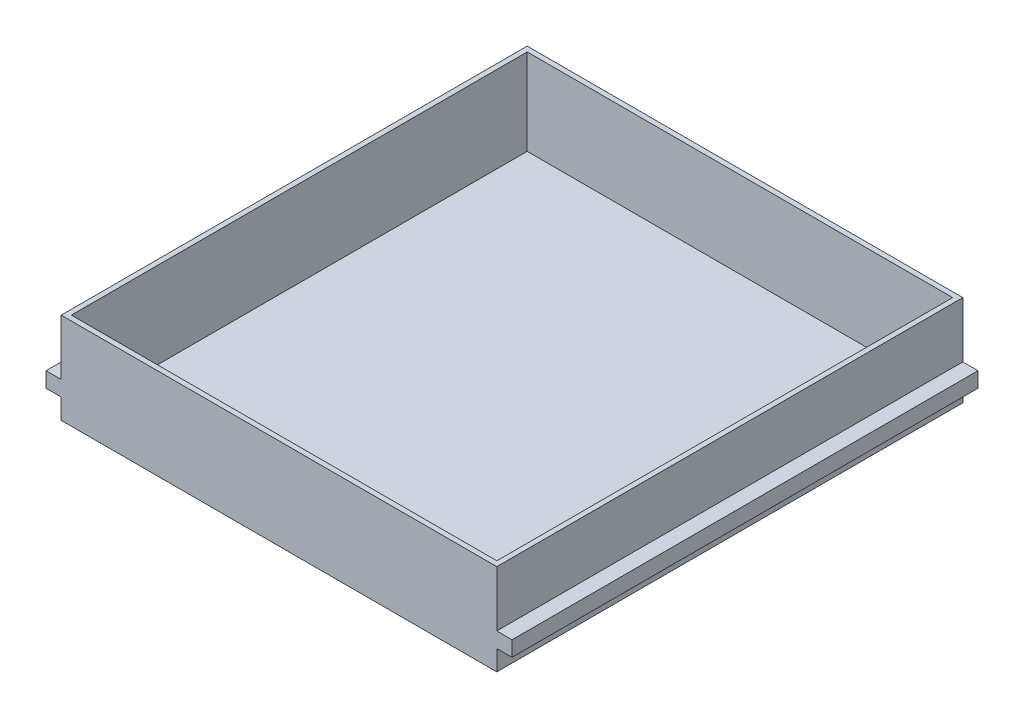
ISO-10303-21;
HEADER;
FILE_DESCRIPTION(('STEP AP214'),'2;1');
FILE_NAME('part.step','',(''),(''),'','','');
FILE_SCHEMA(('AUTOMOTIVE_DESIGN { 1 0 10303 214 1 1 1 1 }'));
ENDSEC;
DATA;
#1=APPLICATION_CONTEXT('core data for automotive mechanical design processes');
#2=APPLICATION_PROTOCOL_DEFINITION('international standard','automotive_design',2000,#1);
#3=PRODUCT_CONTEXT('',#1,'mechanical');
#4=PRODUCT('Part','Part','',(#3));
#5=PRODUCT_RELATED_PRODUCT_CATEGORY('part','',(#4));
#6=PRODUCT_DEFINITION_FORMATION('','',#4);
#7=PRODUCT_DEFINITION_CONTEXT('part definition',#1,'design');
#8=PRODUCT_DEFINITION('design','',#6,#7);
#9=PRODUCT_DEFINITION_SHAPE('','',#8);
#10=(LENGTH_UNIT() NAMED_UNIT(*) SI_UNIT(.MILLI.,.METRE.));
#11=(NAMED_UNIT(*) PLANE_ANGLE_UNIT() SI_UNIT($,.RADIAN.));
#12=(NAMED_UNIT(*) SI_UNIT($,.STERADIAN.) SOLID_ANGLE_UNIT());
#13=UNCERTAINTY_MEASURE_WITH_UNIT(LENGTH_MEASURE(1.E-05),#10,'distance_accuracy_value','');
#14=(GEOMETRIC_REPRESENTATION_CONTEXT(3) GLOBAL_UNCERTAINTY_ASSIGNED_CONTEXT((#13)) GLOBAL_UNIT_ASSIGNED_CONTEXT((#10,
#11,#12)) REPRESENTATION_CONTEXT('',''));
#15=CARTESIAN_POINT('',(0.,0.,0.));
#16=DIRECTION('',(0.,0.,1.));
#17=DIRECTION('',(1.,0.,0.));
#18=AXIS2_PLACEMENT_3D('',#15,#16,#17);
#19=CARTESIAN_POINT('',(546.1,12.7,584.2));
#20=DIRECTION('',(-1.,0.,0.));
#21=DIRECTION('',(0.,0.,1.));
#22=AXIS2_PLACEMENT_3D('',#19,#20,#21);
#23=PLANE('',#22);
#24=DIRECTION('',(0.,0.,-1.));
#25=VECTOR('',#24,1.);
#26=CARTESIAN_POINT('',(546.1,50.8,638.081536726415));
#27=LINE('',#26,#25);
#28=CARTESIAN_POINT('',(546.1,50.8,584.2));
#29=VERTEX_POINT('',#28);
#30=CARTESIAN_POINT('',(546.1,50.8,-584.2));
#31=VERTEX_POINT('',#30);
#32=EDGE_CURVE('E50',#29,#31,#27,.T.);
#33=ORIENTED_EDGE('',*,*,#32,.F.);
#34=DIRECTION('',(0.,-1.,0.));
#35=VECTOR('',#34,1.);
#36=CARTESIAN_POINT('',(546.1,12.7,584.2));
#37=LINE('',#36,#35);
#38=CARTESIAN_POINT('',(546.1,0.,584.2));
#39=VERTEX_POINT('',#38);
#40=EDGE_CURVE('E265',#29,#39,#37,.T.);
#41=ORIENTED_EDGE('',*,*,#40,.T.);
#42=DIRECTION('',(0.,0.,-1.));
#43=VECTOR('',#42,1.);
#44=CARTESIAN_POINT('',(546.1,0.,584.2));
#45=LINE('',#44,#43);
#46=CARTESIAN_POINT('',(546.1,0.,-584.2));
#47=VERTEX_POINT('',#46);
#48=EDGE_CURVE('E254',#39,#47,#45,.T.);
#49=ORIENTED_EDGE('',*,*,#48,.T.);
#50=DIRECTION('',(0.,-1.,0.));
#51=VECTOR('',#50,1.);
#52=CARTESIAN_POINT('',(546.1,12.7,-584.2));
#53=LINE('',#52,#51);
#54=EDGE_CURVE('E43',#31,#47,#53,.T.);
#55=ORIENTED_EDGE('',*,*,#54,.F.);
#56=EDGE_LOOP('',(#33,#41,#49,#55));
#57=FACE_BOUND('',#56,.T.);
#58=ADVANCED_FACE('F35',(#57),#23,.F.);
#59=CARTESIAN_POINT('',(-546.1,12.7,584.2));
#60=DIRECTION('',(1.,0.,0.));
#61=DIRECTION('',(0.,0.,-1.));
#62=AXIS2_PLACEMENT_3D('',#59,#60,#61);
#63=PLANE('',#62);
#64=DIRECTION('',(0.,0.,-1.));
#65=VECTOR('',#64,1.);
#66=CARTESIAN_POINT('',(-546.1,88.9,638.081536726415));
#67=LINE('',#66,#65);
#68=CARTESIAN_POINT('',(-546.1,88.9,584.2));
#69=VERTEX_POINT('',#68);
#70=CARTESIAN_POINT('',(-546.1,88.9,-584.2));
#71=VERTEX_POINT('',#70);
#72=EDGE_CURVE('E188',#69,#71,#67,.T.);
#73=ORIENTED_EDGE('',*,*,#72,.F.);
#74=DIRECTION('',(0.,-1.,0.));
#75=VECTOR('',#74,1.);
#76=CARTESIAN_POINT('',(-546.1,12.7,584.2));
#77=LINE('',#76,#75);
#78=CARTESIAN_POINT('',(-546.1,228.6,584.2));
#79=VERTEX_POINT('',#78);
#80=EDGE_CURVE('E268',#79,#69,#77,.T.);
#81=ORIENTED_EDGE('',*,*,#80,.F.);
#82=DIRECTION('',(0.,0.,1.));
#83=VECTOR('',#82,1.);
#84=CARTESIAN_POINT('',(-546.1,228.6,0.));
#85=LINE('',#84,#83);
#86=CARTESIAN_POINT('',(-546.1,228.6,-584.2));
#87=VERTEX_POINT('',#86);
#88=EDGE_CURVE('E232',#87,#79,#85,.T.);
#89=ORIENTED_EDGE('',*,*,#88,.F.);
#90=DIRECTION('',(0.,-1.,0.));
#91=VECTOR('',#90,1.);
#92=CARTESIAN_POINT('',(-546.1,12.7,-584.2));
#93=LINE('',#92,#91);
#94=EDGE_CURVE('E271',#87,#71,#93,.T.);
#95=ORIENTED_EDGE('',*,*,#94,.T.);
#96=EDGE_LOOP('',(#73,#81,#89,#95));
#97=FACE_BOUND('',#96,.T.);
#98=ADVANCED_FACE('F300',(#97),#63,.F.);
#99=CARTESIAN_POINT('',(546.1,228.6,584.2));
#100=VERTEX_POINT('',#99);
#101=CARTESIAN_POINT('',(546.1,88.9,584.2));
#102=VERTEX_POINT('',#101);
#103=EDGE_CURVE('E58',#100,#102,#37,.T.);
#104=ORIENTED_EDGE('',*,*,#103,.T.);
#105=DIRECTION('',(0.,0.,-1.));
#106=VECTOR('',#105,1.);
#107=CARTESIAN_POINT('',(546.1,88.9,638.081536726415));
#108=LINE('',#107,#106);
#109=CARTESIAN_POINT('',(546.1,88.9,-584.2));
#110=VERTEX_POINT('',#109);
#111=EDGE_CURVE('E159',#102,#110,#108,.T.);
#112=ORIENTED_EDGE('',*,*,#111,.T.);
#113=CARTESIAN_POINT('',(546.1,228.6,-584.2));
#114=VERTEX_POINT('',#113);
#115=EDGE_CURVE('E11',#114,#110,#53,.T.);
#116=ORIENTED_EDGE('',*,*,#115,.F.);
#117=DIRECTION('',(0.,0.,-1.));
#118=VECTOR('',#117,1.);
#119=CARTESIAN_POINT('',(546.1,228.6,0.));
#120=LINE('',#119,#118);
#121=EDGE_CURVE('E226',#100,#114,#120,.T.);
#122=ORIENTED_EDGE('',*,*,#121,.F.);
#123=EDGE_LOOP('',(#104,#112,#116,#122));
#124=FACE_BOUND('',#123,.T.);
#125=ADVANCED_FACE('F37',(#124),#23,.F.);
#126=CARTESIAN_POINT('',(-546.1,12.7,-584.2));
#127=DIRECTION('',(0.,0.,1.));
#128=DIRECTION('',(1.,0.,0.));
#129=AXIS2_PLACEMENT_3D('',#126,#127,#128);
#130=PLANE('',#129);
#131=DIRECTION('',(-1.,0.,0.));
#132=VECTOR('',#131,1.);
#133=CARTESIAN_POINT('',(-546.1,0.,-584.2));
#134=LINE('',#133,#132);
#135=CARTESIAN_POINT('',(-546.1,0.,-584.2));
#136=VERTEX_POINT('',#135);
#137=EDGE_CURVE('E257',#47,#136,#134,.T.);
#138=ORIENTED_EDGE('',*,*,#137,.T.);
#139=CARTESIAN_POINT('',(-546.1,50.8,-584.2));
#140=VERTEX_POINT('',#139);
#141=EDGE_CURVE('E270',#140,#136,#93,.T.);
#142=ORIENTED_EDGE('',*,*,#141,.F.);
#143=DIRECTION('',(-1.,0.,0.));
#144=VECTOR('',#143,1.);
#145=CARTESIAN_POINT('',(-546.1,50.8,-584.2));
#146=LINE('',#145,#144);
#147=CARTESIAN_POINT('',(-584.2,50.8,-584.2));
#148=VERTEX_POINT('',#147);
#149=EDGE_CURVE('E184',#140,#148,#146,.T.);
#150=ORIENTED_EDGE('',*,*,#149,.T.);
#151=DIRECTION('',(0.,1.,0.));
#152=VECTOR('',#151,1.);
#153=CARTESIAN_POINT('',(-584.2,50.8,-584.2));
#154=LINE('',#153,#152);
#155=CARTESIAN_POINT('',(-584.2,88.9,-584.2));
#156=VERTEX_POINT('',#155);
#157=EDGE_CURVE('E193',#148,#156,#154,.T.);
#158=ORIENTED_EDGE('',*,*,#157,.T.);
#159=DIRECTION('',(1.,0.,0.));
#160=VECTOR('',#159,1.);
#161=CARTESIAN_POINT('',(-546.1,88.9,-584.2));
#162=LINE('',#161,#160);
#163=EDGE_CURVE('E196',#156,#71,#162,.T.);
#164=ORIENTED_EDGE('',*,*,#163,.T.);
#165=ORIENTED_EDGE('',*,*,#94,.F.);
#166=DIRECTION('',(-1.,0.,0.));
#167=VECTOR('',#166,1.);
#168=CARTESIAN_POINT('',(0.,228.6,-584.2));
#169=LINE('',#168,#167);
#170=EDGE_CURVE('E229',#114,#87,#169,.T.);
#171=ORIENTED_EDGE('',*,*,#170,.F.);
#172=ORIENTED_EDGE('',*,*,#115,.T.);
#173=DIRECTION('',(1.,0.,0.));
#174=VECTOR('',#173,1.);
#175=CARTESIAN_POINT('',(546.1,88.9,-584.2));
#176=LINE('',#175,#174);
#177=CARTESIAN_POINT('',(584.2,88.9,-584.2));
#178=VERTEX_POINT('',#177);
#179=EDGE_CURVE('E154',#110,#178,#176,.T.);
#180=ORIENTED_EDGE('',*,*,#179,.T.);
#181=DIRECTION('',(0.,-1.,0.));
#182=VECTOR('',#181,1.);
#183=CARTESIAN_POINT('',(584.2,50.8,-584.2));
#184=LINE('',#183,#182);
#185=CARTESIAN_POINT('',(584.2,50.8,-584.2));
#186=VERTEX_POINT('',#185);
#187=EDGE_CURVE('E162',#178,#186,#184,.T.);
#188=ORIENTED_EDGE('',*,*,#187,.T.);
#189=DIRECTION('',(-1.,0.,0.));
#190=VECTOR('',#189,1.);
#191=CARTESIAN_POINT('',(546.1,50.8,-584.2));
#192=LINE('',#191,#190);
#193=EDGE_CURVE('E168',#186,#31,#192,.T.);
#194=ORIENTED_EDGE('',*,*,#193,.T.);
#195=ORIENTED_EDGE('',*,*,#54,.T.);
#196=EDGE_LOOP('',(#138,#142,#150,#158,#164,#165,#171,#172,#180,#188,#194,#195));
#197=FACE_BOUND('',#196,.T.);
#198=ADVANCED_FACE('F171',(#197),#130,.F.);
#199=CARTESIAN_POINT('',(-546.1,50.8,584.2));
#200=VERTEX_POINT('',#199);
#201=CARTESIAN_POINT('',(-546.1,0.,584.2));
#202=VERTEX_POINT('',#201);
#203=EDGE_CURVE('E267',#200,#202,#77,.T.);
#204=ORIENTED_EDGE('',*,*,#203,.F.);
#205=DIRECTION('',(0.,0.,-1.));
#206=VECTOR('',#205,1.);
#207=CARTESIAN_POINT('',(-546.1,50.8,638.081536726415));
#208=LINE('',#207,#206);
#209=EDGE_CURVE('E199',#200,#140,#208,.T.);
#210=ORIENTED_EDGE('',*,*,#209,.T.);
#211=ORIENTED_EDGE('',*,*,#141,.T.);
#212=DIRECTION('',(0.,0.,1.));
#213=VECTOR('',#212,1.);
#214=CARTESIAN_POINT('',(-546.1,0.,584.2));
#215=LINE('',#214,#213);
#216=EDGE_CURVE('E259',#136,#202,#215,.T.);
#217=ORIENTED_EDGE('',*,*,#216,.T.);
#218=EDGE_LOOP('',(#204,#210,#211,#217));
#219=FACE_BOUND('',#218,.T.);
#220=ADVANCED_FACE('F276',(#219),#63,.F.);
#221=CARTESIAN_POINT('',(-546.1,12.7,584.2));
#222=DIRECTION('',(0.,0.,-1.));
#223=DIRECTION('',(-1.,0.,0.));
#224=AXIS2_PLACEMENT_3D('',#221,#222,#223);
#225=PLANE('',#224);
#226=DIRECTION('',(1.,0.,0.));
#227=VECTOR('',#226,1.);
#228=CARTESIAN_POINT('',(-546.1,0.,584.2));
#229=LINE('',#228,#227);
#230=EDGE_CURVE('E262',#202,#39,#229,.T.);
#231=ORIENTED_EDGE('',*,*,#230,.T.);
#232=ORIENTED_EDGE('',*,*,#40,.F.);
#233=DIRECTION('',(1.,0.,0.));
#234=VECTOR('',#233,1.);
#235=CARTESIAN_POINT('',(546.1,50.8,584.2));
#236=LINE('',#235,#234);
#237=CARTESIAN_POINT('',(584.2,50.8,584.2));
#238=VERTEX_POINT('',#237);
#239=EDGE_CURVE('E175',#29,#238,#236,.T.);
#240=ORIENTED_EDGE('',*,*,#239,.T.);
#241=DIRECTION('',(0.,1.,0.));
#242=VECTOR('',#241,1.);
#243=CARTESIAN_POINT('',(584.2,50.8,584.2));
#244=LINE('',#243,#242);
#245=CARTESIAN_POINT('',(584.2,88.9,584.2));
#246=VERTEX_POINT('',#245);
#247=EDGE_CURVE('E180',#238,#246,#244,.T.);
#248=ORIENTED_EDGE('',*,*,#247,.T.);
#249=DIRECTION('',(-1.,0.,0.));
#250=VECTOR('',#249,1.);
#251=CARTESIAN_POINT('',(546.1,88.9,584.2));
#252=LINE('',#251,#250);
#253=EDGE_CURVE('E155',#246,#102,#252,.T.);
#254=ORIENTED_EDGE('',*,*,#253,.T.);
#255=ORIENTED_EDGE('',*,*,#103,.F.);
#256=DIRECTION('',(1.,0.,0.));
#257=VECTOR('',#256,1.);
#258=CARTESIAN_POINT('',(0.,228.6,584.2));
#259=LINE('',#258,#257);
#260=EDGE_CURVE('E223',#79,#100,#259,.T.);
#261=ORIENTED_EDGE('',*,*,#260,.F.);
#262=ORIENTED_EDGE('',*,*,#80,.T.);
#263=DIRECTION('',(-1.,0.,0.));
#264=VECTOR('',#263,1.);
#265=CARTESIAN_POINT('',(-546.1,88.9,584.2));
#266=LINE('',#265,#264);
#267=CARTESIAN_POINT('',(-584.2,88.9,584.2));
#268=VERTEX_POINT('',#267);
#269=EDGE_CURVE('E187',#69,#268,#266,.T.);
#270=ORIENTED_EDGE('',*,*,#269,.T.);
#271=DIRECTION('',(0.,-1.,0.));
#272=VECTOR('',#271,1.);
#273=CARTESIAN_POINT('',(-584.2,50.8,584.2));
#274=LINE('',#273,#272);
#275=CARTESIAN_POINT('',(-584.2,50.8,584.2));
#276=VERTEX_POINT('',#275);
#277=EDGE_CURVE('E185',#268,#276,#274,.T.);
#278=ORIENTED_EDGE('',*,*,#277,.T.);
#279=DIRECTION('',(1.,0.,0.));
#280=VECTOR('',#279,1.);
#281=CARTESIAN_POINT('',(-546.1,50.8,584.2));
#282=LINE('',#281,#280);
#283=EDGE_CURVE('E190',#276,#200,#282,.T.);
#284=ORIENTED_EDGE('',*,*,#283,.T.);
#285=ORIENTED_EDGE('',*,*,#203,.T.);
#286=EDGE_LOOP('',(#231,#232,#240,#248,#254,#255,#261,#262,#270,#278,#284,#285));
#287=FACE_BOUND('',#286,.T.);
#288=ADVANCED_FACE('F286',(#287),#225,.F.);
#289=CARTESIAN_POINT('',(0.,0.,0.));
#290=DIRECTION('',(0.,-1.,0.));
#291=DIRECTION('',(0.,0.,-1.));
#292=AXIS2_PLACEMENT_3D('',#289,#290,#291);
#293=PLANE('',#292);
#294=ORIENTED_EDGE('',*,*,#48,.F.);
#295=ORIENTED_EDGE('',*,*,#230,.F.);
#296=ORIENTED_EDGE('',*,*,#216,.F.);
#297=ORIENTED_EDGE('',*,*,#137,.F.);
#298=EDGE_LOOP('',(#294,#295,#296,#297));
#299=FACE_BOUND('',#298,.T.);
#300=ADVANCED_FACE('F284',(#299),#293,.T.);
#301=CARTESIAN_POINT('',(0.,228.6,571.5));
#302=DIRECTION('',(0.,0.,-1.));
#303=DIRECTION('',(-1.,0.,0.));
#304=AXIS2_PLACEMENT_3D('',#301,#302,#303);
#305=PLANE('',#304);
#306=DIRECTION('',(1.,0.,0.));
#307=VECTOR('',#306,1.);
#308=CARTESIAN_POINT('',(0.,12.7,571.5));
#309=LINE('',#308,#307);
#310=CARTESIAN_POINT('',(-533.4,12.7,571.5));
#311=VERTEX_POINT('',#310);
#312=CARTESIAN_POINT('',(533.4,12.7,571.5));
#313=VERTEX_POINT('',#312);
#314=EDGE_CURVE('E209',#311,#313,#309,.T.);
#315=ORIENTED_EDGE('',*,*,#314,.F.);
#316=DIRECTION('',(0.,-1.,0.));
#317=VECTOR('',#316,1.);
#318=CARTESIAN_POINT('',(-533.4,228.6,571.5));
#319=LINE('',#318,#317);
#320=CARTESIAN_POINT('',(-533.4,228.6,571.5));
#321=VERTEX_POINT('',#320);
#322=EDGE_CURVE('E252',#321,#311,#319,.T.);
#323=ORIENTED_EDGE('',*,*,#322,.F.);
#324=DIRECTION('',(1.,0.,0.));
#325=VECTOR('',#324,1.);
#326=CARTESIAN_POINT('',(0.,228.6,571.5));
#327=LINE('',#326,#325);
#328=CARTESIAN_POINT('',(533.4,228.6,571.5));
#329=VERTEX_POINT('',#328);
#330=EDGE_CURVE('E210',#321,#329,#327,.T.);
#331=ORIENTED_EDGE('',*,*,#330,.T.);
#332=DIRECTION('',(0.,-1.,0.));
#333=VECTOR('',#332,1.);
#334=CARTESIAN_POINT('',(533.4,228.6,571.5));
#335=LINE('',#334,#333);
#336=EDGE_CURVE('E235',#329,#313,#335,.T.);
#337=ORIENTED_EDGE('',*,*,#336,.T.);
#338=EDGE_LOOP('',(#315,#323,#331,#337));
#339=FACE_BOUND('',#338,.T.);
#340=ADVANCED_FACE('F425',(#339),#305,.T.);
#341=CARTESIAN_POINT('',(-533.4,228.6,0.));
#342=DIRECTION('',(1.,0.,0.));
#343=DIRECTION('',(0.,0.,-1.));
#344=AXIS2_PLACEMENT_3D('',#341,#342,#343);
#345=PLANE('',#344);
#346=DIRECTION('',(0.,0.,1.));
#347=VECTOR('',#346,1.);
#348=CARTESIAN_POINT('',(-533.4,12.7,0.));
#349=LINE('',#348,#347);
#350=CARTESIAN_POINT('',(-533.4,12.7,-571.5));
#351=VERTEX_POINT('',#350);
#352=EDGE_CURVE('E238',#351,#311,#349,.T.);
#353=ORIENTED_EDGE('',*,*,#352,.F.);
#354=DIRECTION('',(0.,-1.,0.));
#355=VECTOR('',#354,1.);
#356=CARTESIAN_POINT('',(-533.4,228.6,-571.5));
#357=LINE('',#356,#355);
#358=CARTESIAN_POINT('',(-533.4,228.6,-571.5));
#359=VERTEX_POINT('',#358);
#360=EDGE_CURVE('E250',#359,#351,#357,.T.);
#361=ORIENTED_EDGE('',*,*,#360,.F.);
#362=DIRECTION('',(0.,0.,1.));
#363=VECTOR('',#362,1.);
#364=CARTESIAN_POINT('',(-533.4,228.6,0.));
#365=LINE('',#364,#363);
#366=EDGE_CURVE('E213',#359,#321,#365,.T.);
#367=ORIENTED_EDGE('',*,*,#366,.T.);
#368=ORIENTED_EDGE('',*,*,#322,.T.);
#369=EDGE_LOOP('',(#353,#361,#367,#368));
#370=FACE_BOUND('',#369,.T.);
#371=ADVANCED_FACE('F421',(#370),#345,.T.);
#372=CARTESIAN_POINT('',(0.,228.6,-571.5));
#373=DIRECTION('',(0.,0.,1.));
#374=DIRECTION('',(1.,0.,0.));
#375=AXIS2_PLACEMENT_3D('',#372,#373,#374);
#376=PLANE('',#375);
#377=DIRECTION('',(-1.,0.,0.));
#378=VECTOR('',#377,1.);
#379=CARTESIAN_POINT('',(0.,12.7,-571.5));
#380=LINE('',#379,#378);
#381=CARTESIAN_POINT('',(533.4,12.7,-571.5));
#382=VERTEX_POINT('',#381);
#383=EDGE_CURVE('E241',#382,#351,#380,.T.);
#384=ORIENTED_EDGE('',*,*,#383,.F.);
#385=DIRECTION('',(0.,-1.,0.));
#386=VECTOR('',#385,1.);
#387=CARTESIAN_POINT('',(533.4,228.6,-571.5));
#388=LINE('',#387,#386);
#389=CARTESIAN_POINT('',(533.4,228.6,-571.5));
#390=VERTEX_POINT('',#389);
#391=EDGE_CURVE('E247',#390,#382,#388,.T.);
#392=ORIENTED_EDGE('',*,*,#391,.F.);
#393=DIRECTION('',(-1.,0.,0.));
#394=VECTOR('',#393,1.);
#395=CARTESIAN_POINT('',(0.,228.6,-571.5));
#396=LINE('',#395,#394);
#397=EDGE_CURVE('E217',#390,#359,#396,.T.);
#398=ORIENTED_EDGE('',*,*,#397,.T.);
#399=ORIENTED_EDGE('',*,*,#360,.T.);
#400=EDGE_LOOP('',(#384,#392,#398,#399));
#401=FACE_BOUND('',#400,.T.);
#402=ADVANCED_FACE('F417',(#401),#376,.T.);
#403=CARTESIAN_POINT('',(533.4,228.6,0.));
#404=DIRECTION('',(-1.,0.,0.));
#405=DIRECTION('',(0.,0.,1.));
#406=AXIS2_PLACEMENT_3D('',#403,#404,#405);
#407=PLANE('',#406);
#408=DIRECTION('',(0.,0.,-1.));
#409=VECTOR('',#408,1.);
#410=CARTESIAN_POINT('',(533.4,12.7,0.));
#411=LINE('',#410,#409);
#412=EDGE_CURVE('E214',#313,#382,#411,.T.);
#413=ORIENTED_EDGE('',*,*,#412,.F.);
#414=ORIENTED_EDGE('',*,*,#336,.F.);
#415=DIRECTION('',(0.,0.,-1.));
#416=VECTOR('',#415,1.);
#417=CARTESIAN_POINT('',(533.4,228.6,0.));
#418=LINE('',#417,#416);
#419=EDGE_CURVE('E220',#329,#390,#418,.T.);
#420=ORIENTED_EDGE('',*,*,#419,.T.);
#421=ORIENTED_EDGE('',*,*,#391,.T.);
#422=EDGE_LOOP('',(#413,#414,#420,#421));
#423=FACE_BOUND('',#422,.T.);
#424=ADVANCED_FACE('F413',(#423),#407,.T.);
#425=CARTESIAN_POINT('',(0.,228.6,0.));
#426=DIRECTION('',(0.,1.,0.));
#427=DIRECTION('',(0.,0.,1.));
#428=AXIS2_PLACEMENT_3D('',#425,#426,#427);
#429=PLANE('',#428);
#430=ORIENTED_EDGE('',*,*,#330,.F.);
#431=ORIENTED_EDGE('',*,*,#366,.F.);
#432=ORIENTED_EDGE('',*,*,#397,.F.);
#433=ORIENTED_EDGE('',*,*,#419,.F.);
#434=EDGE_LOOP('',(#430,#431,#432,#433));
#435=FACE_BOUND('',#434,.T.);
#436=ORIENTED_EDGE('',*,*,#260,.T.);
#437=ORIENTED_EDGE('',*,*,#121,.T.);
#438=ORIENTED_EDGE('',*,*,#170,.T.);
#439=ORIENTED_EDGE('',*,*,#88,.T.);
#440=EDGE_LOOP('',(#436,#437,#438,#439));
#441=FACE_BOUND('',#440,.T.);
#442=ADVANCED_FACE('F303',(#435,#441),#429,.T.);
#443=CARTESIAN_POINT('',(0.,12.7,0.));
#444=DIRECTION('',(0.,-1.,0.));
#445=DIRECTION('',(0.,0.,-1.));
#446=AXIS2_PLACEMENT_3D('',#443,#444,#445);
#447=PLANE('',#446);
#448=ORIENTED_EDGE('',*,*,#352,.T.);
#449=ORIENTED_EDGE('',*,*,#314,.T.);
#450=ORIENTED_EDGE('',*,*,#412,.T.);
#451=ORIENTED_EDGE('',*,*,#383,.T.);
#452=EDGE_LOOP('',(#448,#449,#450,#451));
#453=FACE_BOUND('',#452,.T.);
#454=ADVANCED_FACE('F363',(#453),#447,.F.);
#455=CARTESIAN_POINT('',(-546.1,88.9,638.081536726415));
#456=DIRECTION('',(0.,1.,0.));
#457=DIRECTION('',(0.,0.,1.));
#458=AXIS2_PLACEMENT_3D('',#455,#456,#457);
#459=PLANE('',#458);
#460=ORIENTED_EDGE('',*,*,#269,.F.);
#461=ORIENTED_EDGE('',*,*,#72,.T.);
#462=ORIENTED_EDGE('',*,*,#163,.F.);
#463=DIRECTION('',(0.,0.,-1.));
#464=VECTOR('',#463,1.);
#465=CARTESIAN_POINT('',(-584.2,88.9,638.081536726415));
#466=LINE('',#465,#464);
#467=EDGE_CURVE('E202',#268,#156,#466,.T.);
#468=ORIENTED_EDGE('',*,*,#467,.F.);
#469=EDGE_LOOP('',(#460,#461,#462,#468));
#470=FACE_BOUND('',#469,.T.);
#471=ADVANCED_FACE('F299',(#470),#459,.T.);
#472=CARTESIAN_POINT('',(-584.2,50.8,638.081536726415));
#473=DIRECTION('',(-1.,0.,0.));
#474=DIRECTION('',(0.,0.,1.));
#475=AXIS2_PLACEMENT_3D('',#472,#473,#474);
#476=PLANE('',#475);
#477=ORIENTED_EDGE('',*,*,#277,.F.);
#478=ORIENTED_EDGE('',*,*,#467,.T.);
#479=ORIENTED_EDGE('',*,*,#157,.F.);
#480=DIRECTION('',(0.,0.,-1.));
#481=VECTOR('',#480,1.);
#482=CARTESIAN_POINT('',(-584.2,50.8,638.081536726415));
#483=LINE('',#482,#481);
#484=EDGE_CURVE('E204',#276,#148,#483,.T.);
#485=ORIENTED_EDGE('',*,*,#484,.F.);
#486=EDGE_LOOP('',(#477,#478,#479,#485));
#487=FACE_BOUND('',#486,.T.);
#488=ADVANCED_FACE('F362',(#487),#476,.T.);
#489=CARTESIAN_POINT('',(-546.1,50.8,638.081536726415));
#490=DIRECTION('',(0.,-1.,0.));
#491=DIRECTION('',(1.,0.,0.));
#492=AXIS2_PLACEMENT_3D('',#489,#490,#491);
#493=PLANE('',#492);
#494=ORIENTED_EDGE('',*,*,#283,.F.);
#495=ORIENTED_EDGE('',*,*,#484,.T.);
#496=ORIENTED_EDGE('',*,*,#149,.F.);
#497=ORIENTED_EDGE('',*,*,#209,.F.);
#498=EDGE_LOOP('',(#494,#495,#496,#497));
#499=FACE_BOUND('',#498,.T.);
#500=ADVANCED_FACE('F292',(#499),#493,.T.);
#501=CARTESIAN_POINT('',(546.1,50.8,638.081536726415));
#502=DIRECTION('',(0.,-1.,0.));
#503=DIRECTION('',(1.,0.,0.));
#504=AXIS2_PLACEMENT_3D('',#501,#502,#503);
#505=PLANE('',#504);
#506=ORIENTED_EDGE('',*,*,#239,.F.);
#507=ORIENTED_EDGE('',*,*,#32,.T.);
#508=ORIENTED_EDGE('',*,*,#193,.F.);
#509=DIRECTION('',(0.,0.,-1.));
#510=VECTOR('',#509,1.);
#511=CARTESIAN_POINT('',(584.2,50.8,638.081536726415));
#512=LINE('',#511,#510);
#513=EDGE_CURVE('E158',#238,#186,#512,.T.);
#514=ORIENTED_EDGE('',*,*,#513,.F.);
#515=EDGE_LOOP('',(#506,#507,#508,#514));
#516=FACE_BOUND('',#515,.T.);
#517=ADVANCED_FACE('F381',(#516),#505,.T.);
#518=CARTESIAN_POINT('',(584.2,50.8,638.081536726415));
#519=DIRECTION('',(1.,0.,0.));
#520=DIRECTION('',(0.,0.,-1.));
#521=AXIS2_PLACEMENT_3D('',#518,#519,#520);
#522=PLANE('',#521);
#523=ORIENTED_EDGE('',*,*,#247,.F.);
#524=ORIENTED_EDGE('',*,*,#513,.T.);
#525=ORIENTED_EDGE('',*,*,#187,.F.);
#526=DIRECTION('',(0.,0.,-1.));
#527=VECTOR('',#526,1.);
#528=CARTESIAN_POINT('',(584.2,88.9,638.081536726415));
#529=LINE('',#528,#527);
#530=EDGE_CURVE('E149',#246,#178,#529,.T.);
#531=ORIENTED_EDGE('',*,*,#530,.F.);
#532=EDGE_LOOP('',(#523,#524,#525,#531));
#533=FACE_BOUND('',#532,.T.);
#534=ADVANCED_FACE('F163',(#533),#522,.T.);
#535=CARTESIAN_POINT('',(546.1,88.9,638.081536726415));
#536=DIRECTION('',(0.,1.,0.));
#537=DIRECTION('',(-1.,0.,0.));
#538=AXIS2_PLACEMENT_3D('',#535,#536,#537);
#539=PLANE('',#538);
#540=ORIENTED_EDGE('',*,*,#253,.F.);
#541=ORIENTED_EDGE('',*,*,#530,.T.);
#542=ORIENTED_EDGE('',*,*,#179,.F.);
#543=ORIENTED_EDGE('',*,*,#111,.F.);
#544=EDGE_LOOP('',(#540,#541,#542,#543));
#545=FACE_BOUND('',#544,.T.);
#546=ADVANCED_FACE('F151',(#545),#539,.T.);
#547=CLOSED_SHELL('',(#58,#98,#125,#198,#220,#288,#300,#340,#371,#402,#424,#442,#454,#471,#488,
#500,#517,#534,#546));
#548=MANIFOLD_SOLID_BREP('B2',#547);
#549=ADVANCED_BREP_SHAPE_REPRESENTATION('',(#18,#548),#14);
#550=SHAPE_DEFINITION_REPRESENTATION(#9,#549);
ENDSEC;
END-ISO-10303-21;
